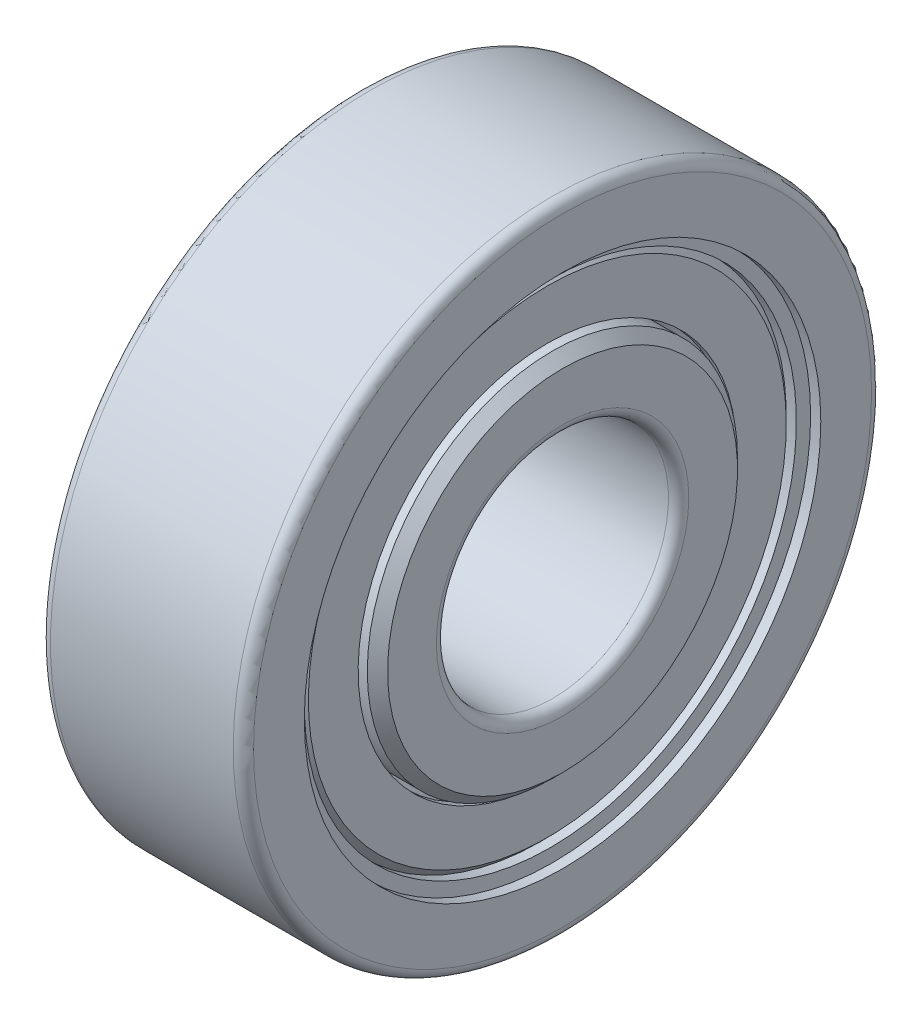
ISO-10303-21;
HEADER;
FILE_DESCRIPTION(('STEP AP214'),'2;1');
FILE_NAME('part.step','',(''),(''),'','','');
FILE_SCHEMA(('AUTOMOTIVE_DESIGN { 1 0 10303 214 1 1 1 1 }'));
ENDSEC;
DATA;
#1=APPLICATION_CONTEXT('core data for automotive mechanical design processes');
#2=APPLICATION_PROTOCOL_DEFINITION('international standard','automotive_design',2000,#1);
#3=PRODUCT_CONTEXT('',#1,'mechanical');
#4=PRODUCT('Part','Part','',(#3));
#5=PRODUCT_RELATED_PRODUCT_CATEGORY('part','',(#4));
#6=PRODUCT_DEFINITION_FORMATION('','',#4);
#7=PRODUCT_DEFINITION_CONTEXT('part definition',#1,'design');
#8=PRODUCT_DEFINITION('design','',#6,#7);
#9=PRODUCT_DEFINITION_SHAPE('','',#8);
#10=(LENGTH_UNIT() NAMED_UNIT(*) SI_UNIT(.MILLI.,.METRE.));
#11=(NAMED_UNIT(*) PLANE_ANGLE_UNIT() SI_UNIT($,.RADIAN.));
#12=(NAMED_UNIT(*) SI_UNIT($,.STERADIAN.) SOLID_ANGLE_UNIT());
#13=UNCERTAINTY_MEASURE_WITH_UNIT(LENGTH_MEASURE(1.E-05),#10,'distance_accuracy_value','');
#14=(GEOMETRIC_REPRESENTATION_CONTEXT(3) GLOBAL_UNCERTAINTY_ASSIGNED_CONTEXT((#13)) GLOBAL_UNIT_ASSIGNED_CONTEXT((#10,
#11,#12)) REPRESENTATION_CONTEXT('',''));
#15=CARTESIAN_POINT('',(0.,0.,0.));
#16=DIRECTION('',(0.,0.,1.));
#17=DIRECTION('',(1.,0.,0.));
#18=AXIS2_PLACEMENT_3D('',#15,#16,#17);
#19=CARTESIAN_POINT('',(3.5,4.,0.));
#20=DIRECTION('',(1.,0.,0.));
#21=DIRECTION('',(0.,1.,0.));
#22=AXIS2_PLACEMENT_3D('',#19,#20,#21);
#23=PLANE('',#22);
#24=CARTESIAN_POINT('',(3.5,0.,0.));
#25=DIRECTION('',(1.,0.,0.));
#26=DIRECTION('',(0.,1.,0.));
#27=AXIS2_PLACEMENT_3D('',#24,#25,#26);
#28=CIRCLE('',#27,6.03);
#29=CARTESIAN_POINT('',(3.5,6.03,0.));
#30=VERTEX_POINT('',#29);
#31=EDGE_CURVE('E69',#30,#30,#28,.T.);
#32=ORIENTED_EDGE('',*,*,#31,.T.);
#33=EDGE_LOOP('',(#32));
#34=FACE_BOUND('',#33,.T.);
#35=CARTESIAN_POINT('',(3.5,0.,0.));
#36=DIRECTION('',(1.,0.,0.));
#37=DIRECTION('',(0.,1.,0.));
#38=AXIS2_PLACEMENT_3D('',#35,#36,#37);
#39=CIRCLE('',#38,4.35);
#40=CARTESIAN_POINT('',(3.5,4.35,0.));
#41=VERTEX_POINT('',#40);
#42=EDGE_CURVE('E95',#41,#41,#39,.F.);
#43=ORIENTED_EDGE('',*,*,#42,.T.);
#44=EDGE_LOOP('',(#43));
#45=FACE_BOUND('',#44,.T.);
#46=ADVANCED_FACE('F47',(#34,#45),#23,.T.);
#47=CARTESIAN_POINT('',(0.,0.,0.));
#48=DIRECTION('',(1.,0.,0.));
#49=DIRECTION('',(0.,1.,0.));
#50=AXIS2_PLACEMENT_3D('',#47,#48,#49);
#51=CYLINDRICAL_SURFACE('',#50,6.38);
#52=CARTESIAN_POINT('',(3.15000000000001,0.,0.));
#53=DIRECTION('',(1.,0.,0.));
#54=DIRECTION('',(0.,1.,0.));
#55=AXIS2_PLACEMENT_3D('',#52,#53,#54);
#56=CIRCLE('',#55,6.38);
#57=CARTESIAN_POINT('',(3.15000000000001,6.38,0.));
#58=VERTEX_POINT('',#57);
#59=EDGE_CURVE('E62',#58,#58,#56,.F.);
#60=ORIENTED_EDGE('',*,*,#59,.T.);
#61=EDGE_LOOP('',(#60));
#62=FACE_BOUND('',#61,.T.);
#63=CARTESIAN_POINT('',(0.999799979996003,0.,0.));
#64=DIRECTION('',(1.,0.,0.));
#65=DIRECTION('',(0.,1.,0.));
#66=AXIS2_PLACEMENT_3D('',#63,#64,#65);
#67=CIRCLE('',#66,6.38);
#68=CARTESIAN_POINT('',(0.999799979996003,6.38,0.));
#69=VERTEX_POINT('',#68);
#70=EDGE_CURVE('E107',#69,#69,#67,.T.);
#71=ORIENTED_EDGE('',*,*,#70,.T.);
#72=EDGE_LOOP('',(#71));
#73=FACE_BOUND('',#72,.T.);
#74=ADVANCED_FACE('F222',(#62,#73),#51,.T.);
#75=CARTESIAN_POINT('',(0.,0.,0.));
#76=DIRECTION('',(1.,0.,0.));
#77=DIRECTION('',(0.,1.,0.));
#78=AXIS2_PLACEMENT_3D('',#75,#76,#77);
#79=TOROIDAL_SURFACE('',#78,7.36,1.4);
#80=CARTESIAN_POINT('',(0.840000000000004,0.,0.));
#81=DIRECTION('',(1.,0.,0.));
#82=DIRECTION('',(0.,1.,0.));
#83=AXIS2_PLACEMENT_3D('',#80,#81,#82);
#84=CIRCLE('',#83,8.48);
#85=CARTESIAN_POINT('',(0.840000000000003,8.48,0.));
#86=VERTEX_POINT('',#85);
#87=EDGE_CURVE('E111',#86,#86,#84,.T.);
#88=ORIENTED_EDGE('',*,*,#87,.T.);
#89=EDGE_LOOP('',(#88));
#90=FACE_BOUND('',#89,.T.);
#91=ORIENTED_EDGE('',*,*,#70,.F.);
#92=EDGE_LOOP('',(#91));
#93=FACE_BOUND('',#92,.T.);
#94=ADVANCED_FACE('F228',(#90,#93),#79,.T.);
#95=CARTESIAN_POINT('',(0.,0.,0.));
#96=DIRECTION('',(1.,0.,0.));
#97=DIRECTION('',(0.,1.,0.));
#98=AXIS2_PLACEMENT_3D('',#95,#96,#97);
#99=CYLINDRICAL_SURFACE('',#98,8.48);
#100=CARTESIAN_POINT('',(2.45,0.,0.));
#101=DIRECTION('',(1.,0.,0.));
#102=DIRECTION('',(0.,1.,0.));
#103=AXIS2_PLACEMENT_3D('',#100,#101,#102);
#104=CIRCLE('',#103,8.48);
#105=CARTESIAN_POINT('',(2.45,8.48,0.));
#106=VERTEX_POINT('',#105);
#107=EDGE_CURVE('E115',#106,#106,#104,.T.);
#108=ORIENTED_EDGE('',*,*,#107,.T.);
#109=EDGE_LOOP('',(#108));
#110=FACE_BOUND('',#109,.T.);
#111=ORIENTED_EDGE('',*,*,#87,.F.);
#112=EDGE_LOOP('',(#111));
#113=FACE_BOUND('',#112,.T.);
#114=ADVANCED_FACE('F263',(#110,#113),#99,.F.);
#115=CARTESIAN_POINT('',(2.45,0.,0.));
#116=DIRECTION('',(-1.,0.,0.));
#117=DIRECTION('',(0.,-1.,0.));
#118=AXIS2_PLACEMENT_3D('',#115,#116,#117);
#119=CONICAL_SURFACE('',#118,8.48,0.785398163397444);
#120=CARTESIAN_POINT('',(2.73000000000001,0.,0.));
#121=DIRECTION('',(1.,0.,0.));
#122=DIRECTION('',(0.,1.,0.));
#123=AXIS2_PLACEMENT_3D('',#120,#121,#122);
#124=CIRCLE('',#123,8.2);
#125=CARTESIAN_POINT('',(2.73000000000001,8.2,0.));
#126=VERTEX_POINT('',#125);
#127=EDGE_CURVE('E119',#126,#126,#124,.T.);
#128=ORIENTED_EDGE('',*,*,#127,.T.);
#129=EDGE_LOOP('',(#128));
#130=FACE_BOUND('',#129,.T.);
#131=ORIENTED_EDGE('',*,*,#107,.F.);
#132=EDGE_LOOP('',(#131));
#133=FACE_BOUND('',#132,.T.);
#134=ADVANCED_FACE('F268',(#130,#133),#119,.F.);
#135=CARTESIAN_POINT('',(2.73000000000001,8.2,0.));
#136=DIRECTION('',(-1.,0.,0.));
#137=DIRECTION('',(0.,-1.,0.));
#138=AXIS2_PLACEMENT_3D('',#135,#136,#137);
#139=PLANE('',#138);
#140=CARTESIAN_POINT('',(2.73000000000001,0.,0.));
#141=DIRECTION('',(1.,0.,0.));
#142=DIRECTION('',(0.,1.,0.));
#143=AXIS2_PLACEMENT_3D('',#140,#141,#142);
#144=CIRCLE('',#143,6.52);
#145=CARTESIAN_POINT('',(2.73000000000001,6.52,0.));
#146=VERTEX_POINT('',#145);
#147=EDGE_CURVE('E123',#146,#146,#144,.T.);
#148=ORIENTED_EDGE('',*,*,#147,.T.);
#149=EDGE_LOOP('',(#148));
#150=FACE_BOUND('',#149,.T.);
#151=ORIENTED_EDGE('',*,*,#127,.F.);
#152=EDGE_LOOP('',(#151));
#153=FACE_BOUND('',#152,.T.);
#154=ADVANCED_FACE('F274',(#150,#153),#139,.T.);
#155=CARTESIAN_POINT('',(0.,0.,0.));
#156=DIRECTION('',(1.,0.,0.));
#157=DIRECTION('',(0.,1.,0.));
#158=AXIS2_PLACEMENT_3D('',#155,#156,#157);
#159=CYLINDRICAL_SURFACE('',#158,6.52);
#160=CARTESIAN_POINT('',(2.975,0.,0.));
#161=DIRECTION('',(1.,0.,0.));
#162=DIRECTION('',(0.,1.,0.));
#163=AXIS2_PLACEMENT_3D('',#160,#161,#162);
#164=CIRCLE('',#163,6.52);
#165=CARTESIAN_POINT('',(2.975,6.52,0.));
#166=VERTEX_POINT('',#165);
#167=EDGE_CURVE('E127',#166,#166,#164,.T.);
#168=ORIENTED_EDGE('',*,*,#167,.T.);
#169=EDGE_LOOP('',(#168));
#170=FACE_BOUND('',#169,.T.);
#171=ORIENTED_EDGE('',*,*,#147,.F.);
#172=EDGE_LOOP('',(#171));
#173=FACE_BOUND('',#172,.T.);
#174=ADVANCED_FACE('F278',(#170,#173),#159,.F.);
#175=CARTESIAN_POINT('',(2.975,6.52,0.));
#176=DIRECTION('',(1.,0.,0.));
#177=DIRECTION('',(0.,1.,0.));
#178=AXIS2_PLACEMENT_3D('',#175,#176,#177);
#179=PLANE('',#178);
#180=CARTESIAN_POINT('',(2.975,0.,0.));
#181=DIRECTION('',(1.,0.,0.));
#182=DIRECTION('',(0.,1.,0.));
#183=AXIS2_PLACEMENT_3D('',#180,#181,#182);
#184=CIRCLE('',#183,8.23500000000001);
#185=CARTESIAN_POINT('',(2.975,8.23500000000001,0.));
#186=VERTEX_POINT('',#185);
#187=EDGE_CURVE('E131',#186,#186,#184,.T.);
#188=ORIENTED_EDGE('',*,*,#187,.T.);
#189=EDGE_LOOP('',(#188));
#190=FACE_BOUND('',#189,.T.);
#191=ORIENTED_EDGE('',*,*,#167,.F.);
#192=EDGE_LOOP('',(#191));
#193=FACE_BOUND('',#192,.T.);
#194=ADVANCED_FACE('F282',(#190,#193),#179,.T.);
#195=CARTESIAN_POINT('',(2.975,0.,0.));
#196=DIRECTION('',(-1.,0.,0.));
#197=DIRECTION('',(0.,-1.,0.));
#198=AXIS2_PLACEMENT_3D('',#195,#196,#197);
#199=CONICAL_SURFACE('',#198,8.23500000000001,0.785398163397438);
#200=CARTESIAN_POINT('',(2.73000000000001,0.,0.));
#201=DIRECTION('',(1.,0.,0.));
#202=DIRECTION('',(0.,1.,0.));
#203=AXIS2_PLACEMENT_3D('',#200,#201,#202);
#204=CIRCLE('',#203,8.48);
#205=CARTESIAN_POINT('',(2.73000000000001,8.48,0.));
#206=VERTEX_POINT('',#205);
#207=EDGE_CURVE('E135',#206,#206,#204,.T.);
#208=ORIENTED_EDGE('',*,*,#207,.T.);
#209=EDGE_LOOP('',(#208));
#210=FACE_BOUND('',#209,.T.);
#211=ORIENTED_EDGE('',*,*,#187,.F.);
#212=EDGE_LOOP('',(#211));
#213=FACE_BOUND('',#212,.T.);
#214=ADVANCED_FACE('F286',(#210,#213),#199,.T.);
#215=CARTESIAN_POINT('',(0.,0.,0.));
#216=DIRECTION('',(1.,0.,0.));
#217=DIRECTION('',(0.,1.,0.));
#218=AXIS2_PLACEMENT_3D('',#215,#216,#217);
#219=CYLINDRICAL_SURFACE('',#218,8.48);
#220=CARTESIAN_POINT('',(3.08,0.,0.));
#221=DIRECTION('',(1.,0.,0.));
#222=DIRECTION('',(0.,1.,0.));
#223=AXIS2_PLACEMENT_3D('',#220,#221,#222);
#224=CIRCLE('',#223,8.48);
#225=CARTESIAN_POINT('',(3.08,8.48,0.));
#226=VERTEX_POINT('',#225);
#227=EDGE_CURVE('E139',#226,#226,#224,.T.);
#228=ORIENTED_EDGE('',*,*,#227,.T.);
#229=EDGE_LOOP('',(#228));
#230=FACE_BOUND('',#229,.T.);
#231=ORIENTED_EDGE('',*,*,#207,.F.);
#232=EDGE_LOOP('',(#231));
#233=FACE_BOUND('',#232,.T.);
#234=ADVANCED_FACE('F290',(#230,#233),#219,.F.);
#235=CARTESIAN_POINT('',(3.08,8.48,0.));
#236=DIRECTION('',(1.,0.,0.));
#237=DIRECTION('',(0.,1.,0.));
#238=AXIS2_PLACEMENT_3D('',#235,#236,#237);
#239=PLANE('',#238);
#240=CARTESIAN_POINT('',(3.08,0.,0.));
#241=DIRECTION('',(1.,0.,0.));
#242=DIRECTION('',(0.,1.,0.));
#243=AXIS2_PLACEMENT_3D('',#240,#241,#242);
#244=CIRCLE('',#243,9.02124355652982);
#245=CARTESIAN_POINT('',(3.08,9.02124355652982,0.));
#246=VERTEX_POINT('',#245);
#247=EDGE_CURVE('E143',#246,#246,#244,.T.);
#248=ORIENTED_EDGE('',*,*,#247,.T.);
#249=EDGE_LOOP('',(#248));
#250=FACE_BOUND('',#249,.T.);
#251=ORIENTED_EDGE('',*,*,#227,.F.);
#252=EDGE_LOOP('',(#251));
#253=FACE_BOUND('',#252,.T.);
#254=ADVANCED_FACE('F294',(#250,#253),#239,.T.);
#255=CARTESIAN_POINT('',(3.08,0.,0.));
#256=DIRECTION('',(-1.,0.,0.));
#257=DIRECTION('',(0.,-1.,0.));
#258=AXIS2_PLACEMENT_3D('',#255,#256,#257);
#259=CONICAL_SURFACE('',#258,9.02124355652982,1.0471975511966);
#260=CARTESIAN_POINT('',(3.15,0.,0.));
#261=DIRECTION('',(1.,0.,0.));
#262=DIRECTION('',(0.,1.,0.));
#263=AXIS2_PLACEMENT_3D('',#260,#261,#262);
#264=CIRCLE('',#263,8.9);
#265=CARTESIAN_POINT('',(3.15,8.9,0.));
#266=VERTEX_POINT('',#265);
#267=EDGE_CURVE('E147',#266,#266,#264,.T.);
#268=ORIENTED_EDGE('',*,*,#267,.T.);
#269=EDGE_LOOP('',(#268));
#270=FACE_BOUND('',#269,.T.);
#271=ORIENTED_EDGE('',*,*,#247,.F.);
#272=EDGE_LOOP('',(#271));
#273=FACE_BOUND('',#272,.T.);
#274=ADVANCED_FACE('F298',(#270,#273),#259,.F.);
#275=CARTESIAN_POINT('',(0.,0.,0.));
#276=DIRECTION('',(1.,0.,0.));
#277=DIRECTION('',(0.,1.,0.));
#278=AXIS2_PLACEMENT_3D('',#275,#276,#277);
#279=CYLINDRICAL_SURFACE('',#278,8.9);
#280=CARTESIAN_POINT('',(3.5,0.,0.));
#281=DIRECTION('',(1.,0.,0.));
#282=DIRECTION('',(0.,1.,0.));
#283=AXIS2_PLACEMENT_3D('',#280,#281,#282);
#284=CIRCLE('',#283,8.9);
#285=CARTESIAN_POINT('',(3.5,8.9,0.));
#286=VERTEX_POINT('',#285);
#287=EDGE_CURVE('E151',#286,#286,#284,.T.);
#288=ORIENTED_EDGE('',*,*,#287,.T.);
#289=EDGE_LOOP('',(#288));
#290=FACE_BOUND('',#289,.T.);
#291=ORIENTED_EDGE('',*,*,#267,.F.);
#292=EDGE_LOOP('',(#291));
#293=FACE_BOUND('',#292,.T.);
#294=ADVANCED_FACE('F302',(#290,#293),#279,.F.);
#295=CARTESIAN_POINT('',(3.5,8.9,0.));
#296=DIRECTION('',(1.,0.,0.));
#297=DIRECTION('',(0.,1.,0.));
#298=AXIS2_PLACEMENT_3D('',#295,#296,#297);
#299=PLANE('',#298);
#300=CARTESIAN_POINT('',(3.5,0.,0.));
#301=DIRECTION('',(1.,0.,0.));
#302=DIRECTION('',(0.,1.,0.));
#303=AXIS2_PLACEMENT_3D('',#300,#301,#302);
#304=CIRCLE('',#303,10.65);
#305=CARTESIAN_POINT('',(3.5,10.65,0.));
#306=VERTEX_POINT('',#305);
#307=EDGE_CURVE('E75',#306,#306,#304,.T.);
#308=ORIENTED_EDGE('',*,*,#307,.T.);
#309=EDGE_LOOP('',(#308));
#310=FACE_BOUND('',#309,.T.);
#311=ORIENTED_EDGE('',*,*,#287,.F.);
#312=EDGE_LOOP('',(#311));
#313=FACE_BOUND('',#312,.T.);
#314=ADVANCED_FACE('F306',(#310,#313),#299,.T.);
#315=CARTESIAN_POINT('',(0.,0.,0.));
#316=DIRECTION('',(1.,0.,0.));
#317=DIRECTION('',(0.,1.,0.));
#318=AXIS2_PLACEMENT_3D('',#315,#316,#317);
#319=CYLINDRICAL_SURFACE('',#318,11.);
#320=CARTESIAN_POINT('',(-3.15,0.,0.));
#321=DIRECTION('',(-1.,0.,0.));
#322=DIRECTION('',(0.,-1.,0.));
#323=AXIS2_PLACEMENT_3D('',#320,#321,#322);
#324=CIRCLE('',#323,11.);
#325=CARTESIAN_POINT('',(-3.15,-11.,0.));
#326=VERTEX_POINT('',#325);
#327=EDGE_CURVE('E83',#326,#326,#324,.F.);
#328=ORIENTED_EDGE('',*,*,#327,.T.);
#329=EDGE_LOOP('',(#328));
#330=FACE_BOUND('',#329,.T.);
#331=CARTESIAN_POINT('',(3.15,0.,0.));
#332=DIRECTION('',(1.,0.,0.));
#333=DIRECTION('',(0.,1.,0.));
#334=AXIS2_PLACEMENT_3D('',#331,#332,#333);
#335=CIRCLE('',#334,11.);
#336=CARTESIAN_POINT('',(3.15,11.,0.));
#337=VERTEX_POINT('',#336);
#338=EDGE_CURVE('E87',#337,#337,#335,.F.);
#339=ORIENTED_EDGE('',*,*,#338,.T.);
#340=EDGE_LOOP('',(#339));
#341=FACE_BOUND('',#340,.T.);
#342=ADVANCED_FACE('F310',(#330,#341),#319,.T.);
#343=CARTESIAN_POINT('',(-3.5,8.9,0.));
#344=DIRECTION('',(-1.,0.,0.));
#345=DIRECTION('',(0.,-1.,0.));
#346=AXIS2_PLACEMENT_3D('',#343,#344,#345);
#347=PLANE('',#346);
#348=CARTESIAN_POINT('',(-3.5,0.,0.));
#349=DIRECTION('',(-1.,0.,0.));
#350=DIRECTION('',(0.,-1.,0.));
#351=AXIS2_PLACEMENT_3D('',#348,#349,#350);
#352=CIRCLE('',#351,10.65);
#353=CARTESIAN_POINT('',(-3.5,-10.65,0.));
#354=VERTEX_POINT('',#353);
#355=EDGE_CURVE('E79',#354,#354,#352,.T.);
#356=ORIENTED_EDGE('',*,*,#355,.T.);
#357=EDGE_LOOP('',(#356));
#358=FACE_BOUND('',#357,.T.);
#359=CARTESIAN_POINT('',(-3.5,0.,0.));
#360=DIRECTION('',(1.,0.,0.));
#361=DIRECTION('',(0.,1.,0.));
#362=AXIS2_PLACEMENT_3D('',#359,#360,#361);
#363=CIRCLE('',#362,8.9);
#364=CARTESIAN_POINT('',(-3.5,8.9,0.));
#365=VERTEX_POINT('',#364);
#366=EDGE_CURVE('E155',#365,#365,#363,.T.);
#367=ORIENTED_EDGE('',*,*,#366,.T.);
#368=EDGE_LOOP('',(#367));
#369=FACE_BOUND('',#368,.T.);
#370=ADVANCED_FACE('F314',(#358,#369),#347,.T.);
#371=CARTESIAN_POINT('',(0.,0.,0.));
#372=DIRECTION('',(1.,0.,0.));
#373=DIRECTION('',(0.,1.,0.));
#374=AXIS2_PLACEMENT_3D('',#371,#372,#373);
#375=CYLINDRICAL_SURFACE('',#374,8.9);
#376=CARTESIAN_POINT('',(-3.15,0.,0.));
#377=DIRECTION('',(1.,0.,0.));
#378=DIRECTION('',(0.,1.,0.));
#379=AXIS2_PLACEMENT_3D('',#376,#377,#378);
#380=CIRCLE('',#379,8.9);
#381=CARTESIAN_POINT('',(-3.15,8.9,0.));
#382=VERTEX_POINT('',#381);
#383=EDGE_CURVE('E159',#382,#382,#380,.T.);
#384=ORIENTED_EDGE('',*,*,#383,.T.);
#385=EDGE_LOOP('',(#384));
#386=FACE_BOUND('',#385,.T.);
#387=ORIENTED_EDGE('',*,*,#366,.F.);
#388=EDGE_LOOP('',(#387));
#389=FACE_BOUND('',#388,.T.);
#390=ADVANCED_FACE('F318',(#386,#389),#375,.F.);
#391=CARTESIAN_POINT('',(-3.15,0.,0.));
#392=DIRECTION('',(1.,0.,0.));
#393=DIRECTION('',(0.,1.,0.));
#394=AXIS2_PLACEMENT_3D('',#391,#392,#393);
#395=CONICAL_SURFACE('',#394,8.9,1.0471975511966);
#396=CARTESIAN_POINT('',(-3.07999999999999,0.,0.));
#397=DIRECTION('',(1.,0.,0.));
#398=DIRECTION('',(0.,1.,0.));
#399=AXIS2_PLACEMENT_3D('',#396,#397,#398);
#400=CIRCLE('',#399,9.02124355652982);
#401=CARTESIAN_POINT('',(-3.08,9.02124355652982,0.));
#402=VERTEX_POINT('',#401);
#403=EDGE_CURVE('E163',#402,#402,#400,.T.);
#404=ORIENTED_EDGE('',*,*,#403,.T.);
#405=EDGE_LOOP('',(#404));
#406=FACE_BOUND('',#405,.T.);
#407=ORIENTED_EDGE('',*,*,#383,.F.);
#408=EDGE_LOOP('',(#407));
#409=FACE_BOUND('',#408,.T.);
#410=ADVANCED_FACE('F322',(#406,#409),#395,.F.);
#411=CARTESIAN_POINT('',(-3.08,8.48,0.));
#412=DIRECTION('',(-1.,0.,0.));
#413=DIRECTION('',(0.,-1.,0.));
#414=AXIS2_PLACEMENT_3D('',#411,#412,#413);
#415=PLANE('',#414);
#416=CARTESIAN_POINT('',(-3.08,0.,0.));
#417=DIRECTION('',(1.,0.,0.));
#418=DIRECTION('',(0.,1.,0.));
#419=AXIS2_PLACEMENT_3D('',#416,#417,#418);
#420=CIRCLE('',#419,8.48);
#421=CARTESIAN_POINT('',(-3.08,8.48,0.));
#422=VERTEX_POINT('',#421);
#423=EDGE_CURVE('E167',#422,#422,#420,.T.);
#424=ORIENTED_EDGE('',*,*,#423,.T.);
#425=EDGE_LOOP('',(#424));
#426=FACE_BOUND('',#425,.T.);
#427=ORIENTED_EDGE('',*,*,#403,.F.);
#428=EDGE_LOOP('',(#427));
#429=FACE_BOUND('',#428,.T.);
#430=ADVANCED_FACE('F326',(#426,#429),#415,.T.);
#431=CARTESIAN_POINT('',(0.,0.,0.));
#432=DIRECTION('',(1.,0.,0.));
#433=DIRECTION('',(0.,1.,0.));
#434=AXIS2_PLACEMENT_3D('',#431,#432,#433);
#435=CYLINDRICAL_SURFACE('',#434,8.48);
#436=CARTESIAN_POINT('',(-2.73,0.,0.));
#437=DIRECTION('',(1.,0.,0.));
#438=DIRECTION('',(0.,1.,0.));
#439=AXIS2_PLACEMENT_3D('',#436,#437,#438);
#440=CIRCLE('',#439,8.48);
#441=CARTESIAN_POINT('',(-2.73,8.48,0.));
#442=VERTEX_POINT('',#441);
#443=EDGE_CURVE('E171',#442,#442,#440,.T.);
#444=ORIENTED_EDGE('',*,*,#443,.T.);
#445=EDGE_LOOP('',(#444));
#446=FACE_BOUND('',#445,.T.);
#447=ORIENTED_EDGE('',*,*,#423,.F.);
#448=EDGE_LOOP('',(#447));
#449=FACE_BOUND('',#448,.T.);
#450=ADVANCED_FACE('F330',(#446,#449),#435,.F.);
#451=CARTESIAN_POINT('',(-2.73,0.,0.));
#452=DIRECTION('',(1.,0.,0.));
#453=DIRECTION('',(0.,1.,0.));
#454=AXIS2_PLACEMENT_3D('',#451,#452,#453);
#455=CONICAL_SURFACE('',#454,8.48,0.785398163397438);
#456=CARTESIAN_POINT('',(-2.975,0.,0.));
#457=DIRECTION('',(1.,0.,0.));
#458=DIRECTION('',(0.,1.,0.));
#459=AXIS2_PLACEMENT_3D('',#456,#457,#458);
#460=CIRCLE('',#459,8.23500000000001);
#461=CARTESIAN_POINT('',(-2.975,8.23500000000001,0.));
#462=VERTEX_POINT('',#461);
#463=EDGE_CURVE('E175',#462,#462,#460,.T.);
#464=ORIENTED_EDGE('',*,*,#463,.T.);
#465=EDGE_LOOP('',(#464));
#466=FACE_BOUND('',#465,.T.);
#467=ORIENTED_EDGE('',*,*,#443,.F.);
#468=EDGE_LOOP('',(#467));
#469=FACE_BOUND('',#468,.T.);
#470=ADVANCED_FACE('F334',(#466,#469),#455,.T.);
#471=CARTESIAN_POINT('',(-2.975,6.52,0.));
#472=DIRECTION('',(-1.,0.,0.));
#473=DIRECTION('',(0.,-1.,0.));
#474=AXIS2_PLACEMENT_3D('',#471,#472,#473);
#475=PLANE('',#474);
#476=CARTESIAN_POINT('',(-2.975,0.,0.));
#477=DIRECTION('',(1.,0.,0.));
#478=DIRECTION('',(0.,1.,0.));
#479=AXIS2_PLACEMENT_3D('',#476,#477,#478);
#480=CIRCLE('',#479,6.52);
#481=CARTESIAN_POINT('',(-2.975,6.52,0.));
#482=VERTEX_POINT('',#481);
#483=EDGE_CURVE('E179',#482,#482,#480,.T.);
#484=ORIENTED_EDGE('',*,*,#483,.T.);
#485=EDGE_LOOP('',(#484));
#486=FACE_BOUND('',#485,.T.);
#487=ORIENTED_EDGE('',*,*,#463,.F.);
#488=EDGE_LOOP('',(#487));
#489=FACE_BOUND('',#488,.T.);
#490=ADVANCED_FACE('F338',(#486,#489),#475,.T.);
#491=CARTESIAN_POINT('',(0.,0.,0.));
#492=DIRECTION('',(1.,0.,0.));
#493=DIRECTION('',(0.,1.,0.));
#494=AXIS2_PLACEMENT_3D('',#491,#492,#493);
#495=CYLINDRICAL_SURFACE('',#494,6.52);
#496=CARTESIAN_POINT('',(-2.73,0.,0.));
#497=DIRECTION('',(1.,0.,0.));
#498=DIRECTION('',(0.,1.,0.));
#499=AXIS2_PLACEMENT_3D('',#496,#497,#498);
#500=CIRCLE('',#499,6.52);
#501=CARTESIAN_POINT('',(-2.73,6.52,0.));
#502=VERTEX_POINT('',#501);
#503=EDGE_CURVE('E183',#502,#502,#500,.T.);
#504=ORIENTED_EDGE('',*,*,#503,.T.);
#505=EDGE_LOOP('',(#504));
#506=FACE_BOUND('',#505,.T.);
#507=ORIENTED_EDGE('',*,*,#483,.F.);
#508=EDGE_LOOP('',(#507));
#509=FACE_BOUND('',#508,.T.);
#510=ADVANCED_FACE('F342',(#506,#509),#495,.F.);
#511=CARTESIAN_POINT('',(-2.73,8.2,0.));
#512=DIRECTION('',(1.,0.,0.));
#513=DIRECTION('',(0.,1.,0.));
#514=AXIS2_PLACEMENT_3D('',#511,#512,#513);
#515=PLANE('',#514);
#516=CARTESIAN_POINT('',(-2.73,0.,0.));
#517=DIRECTION('',(1.,0.,0.));
#518=DIRECTION('',(0.,1.,0.));
#519=AXIS2_PLACEMENT_3D('',#516,#517,#518);
#520=CIRCLE('',#519,8.2);
#521=CARTESIAN_POINT('',(-2.73,8.2,0.));
#522=VERTEX_POINT('',#521);
#523=EDGE_CURVE('E187',#522,#522,#520,.T.);
#524=ORIENTED_EDGE('',*,*,#523,.T.);
#525=EDGE_LOOP('',(#524));
#526=FACE_BOUND('',#525,.T.);
#527=ORIENTED_EDGE('',*,*,#503,.F.);
#528=EDGE_LOOP('',(#527));
#529=FACE_BOUND('',#528,.T.);
#530=ADVANCED_FACE('F346',(#526,#529),#515,.T.);
#531=CARTESIAN_POINT('',(-2.73,0.,0.));
#532=DIRECTION('',(1.,0.,0.));
#533=DIRECTION('',(0.,1.,0.));
#534=AXIS2_PLACEMENT_3D('',#531,#532,#533);
#535=CONICAL_SURFACE('',#534,8.2,0.785398163397444);
#536=CARTESIAN_POINT('',(-2.45,0.,0.));
#537=DIRECTION('',(1.,0.,0.));
#538=DIRECTION('',(0.,1.,0.));
#539=AXIS2_PLACEMENT_3D('',#536,#537,#538);
#540=CIRCLE('',#539,8.48);
#541=CARTESIAN_POINT('',(-2.45,8.48,0.));
#542=VERTEX_POINT('',#541);
#543=EDGE_CURVE('E191',#542,#542,#540,.T.);
#544=ORIENTED_EDGE('',*,*,#543,.T.);
#545=EDGE_LOOP('',(#544));
#546=FACE_BOUND('',#545,.T.);
#547=ORIENTED_EDGE('',*,*,#523,.F.);
#548=EDGE_LOOP('',(#547));
#549=FACE_BOUND('',#548,.T.);
#550=ADVANCED_FACE('F350',(#546,#549),#535,.F.);
#551=CARTESIAN_POINT('',(0.,0.,0.));
#552=DIRECTION('',(1.,0.,0.));
#553=DIRECTION('',(0.,1.,0.));
#554=AXIS2_PLACEMENT_3D('',#551,#552,#553);
#555=CYLINDRICAL_SURFACE('',#554,8.48);
#556=CARTESIAN_POINT('',(-0.839999999999997,0.,0.));
#557=DIRECTION('',(1.,0.,0.));
#558=DIRECTION('',(0.,1.,0.));
#559=AXIS2_PLACEMENT_3D('',#556,#557,#558);
#560=CIRCLE('',#559,8.48);
#561=CARTESIAN_POINT('',(-0.839999999999999,8.48,0.));
#562=VERTEX_POINT('',#561);
#563=EDGE_CURVE('E195',#562,#562,#560,.T.);
#564=ORIENTED_EDGE('',*,*,#563,.T.);
#565=EDGE_LOOP('',(#564));
#566=FACE_BOUND('',#565,.T.);
#567=ORIENTED_EDGE('',*,*,#543,.F.);
#568=EDGE_LOOP('',(#567));
#569=FACE_BOUND('',#568,.T.);
#570=ADVANCED_FACE('F219',(#566,#569),#555,.F.);
#571=CARTESIAN_POINT('',(0.,0.,0.));
#572=DIRECTION('',(1.,0.,0.));
#573=DIRECTION('',(0.,1.,0.));
#574=AXIS2_PLACEMENT_3D('',#571,#572,#573);
#575=TOROIDAL_SURFACE('',#574,7.36,1.4);
#576=CARTESIAN_POINT('',(-0.999799979995997,0.,0.));
#577=DIRECTION('',(1.,0.,0.));
#578=DIRECTION('',(0.,1.,0.));
#579=AXIS2_PLACEMENT_3D('',#576,#577,#578);
#580=CIRCLE('',#579,6.38);
#581=CARTESIAN_POINT('',(-0.999799979995998,6.38,0.));
#582=VERTEX_POINT('',#581);
#583=EDGE_CURVE('E199',#582,#582,#580,.T.);
#584=ORIENTED_EDGE('',*,*,#583,.T.);
#585=EDGE_LOOP('',(#584));
#586=FACE_BOUND('',#585,.T.);
#587=ORIENTED_EDGE('',*,*,#563,.F.);
#588=EDGE_LOOP('',(#587));
#589=FACE_BOUND('',#588,.T.);
#590=ADVANCED_FACE('F206',(#586,#589),#575,.T.);
#591=CARTESIAN_POINT('',(0.,0.,0.));
#592=DIRECTION('',(1.,0.,0.));
#593=DIRECTION('',(0.,1.,0.));
#594=AXIS2_PLACEMENT_3D('',#591,#592,#593);
#595=CYLINDRICAL_SURFACE('',#594,6.38);
#596=CARTESIAN_POINT('',(-3.15,0.,0.));
#597=DIRECTION('',(-1.,0.,0.));
#598=DIRECTION('',(0.,-1.,0.));
#599=AXIS2_PLACEMENT_3D('',#596,#597,#598);
#600=CIRCLE('',#599,6.38);
#601=CARTESIAN_POINT('',(-3.15,-6.38,0.));
#602=VERTEX_POINT('',#601);
#603=EDGE_CURVE('E55',#602,#602,#600,.F.);
#604=ORIENTED_EDGE('',*,*,#603,.T.);
#605=EDGE_LOOP('',(#604));
#606=FACE_BOUND('',#605,.T.);
#607=ORIENTED_EDGE('',*,*,#583,.F.);
#608=EDGE_LOOP('',(#607));
#609=FACE_BOUND('',#608,.T.);
#610=ADVANCED_FACE('F209',(#606,#609),#595,.T.);
#611=CARTESIAN_POINT('',(-3.5,4.,0.));
#612=DIRECTION('',(-1.,0.,0.));
#613=DIRECTION('',(0.,-1.,0.));
#614=AXIS2_PLACEMENT_3D('',#611,#612,#613);
#615=PLANE('',#614);
#616=CARTESIAN_POINT('',(-3.5,0.,0.));
#617=DIRECTION('',(-1.,0.,0.));
#618=DIRECTION('',(0.,-1.,0.));
#619=AXIS2_PLACEMENT_3D('',#616,#617,#618);
#620=CIRCLE('',#619,6.03000000000001);
#621=CARTESIAN_POINT('',(-3.5,-6.03000000000001,0.));
#622=VERTEX_POINT('',#621);
#623=EDGE_CURVE('E10',#622,#622,#620,.T.);
#624=ORIENTED_EDGE('',*,*,#623,.T.);
#625=EDGE_LOOP('',(#624));
#626=FACE_BOUND('',#625,.T.);
#627=CARTESIAN_POINT('',(-3.5,0.,0.));
#628=DIRECTION('',(-1.,0.,0.));
#629=DIRECTION('',(0.,-1.,0.));
#630=AXIS2_PLACEMENT_3D('',#627,#628,#629);
#631=CIRCLE('',#630,4.35);
#632=CARTESIAN_POINT('',(-3.5,-4.35,0.));
#633=VERTEX_POINT('',#632);
#634=EDGE_CURVE('E91',#633,#633,#631,.F.);
#635=ORIENTED_EDGE('',*,*,#634,.T.);
#636=EDGE_LOOP('',(#635));
#637=FACE_BOUND('',#636,.T.);
#638=ADVANCED_FACE('F211',(#626,#637),#615,.T.);
#639=CARTESIAN_POINT('',(0.,0.,0.));
#640=DIRECTION('',(1.,0.,0.));
#641=DIRECTION('',(0.,1.,0.));
#642=AXIS2_PLACEMENT_3D('',#639,#640,#641);
#643=CYLINDRICAL_SURFACE('',#642,4.);
#644=CARTESIAN_POINT('',(3.15,0.,0.));
#645=DIRECTION('',(1.,0.,0.));
#646=DIRECTION('',(0.,1.,0.));
#647=AXIS2_PLACEMENT_3D('',#644,#645,#646);
#648=CIRCLE('',#647,4.);
#649=CARTESIAN_POINT('',(3.15,4.,0.));
#650=VERTEX_POINT('',#649);
#651=EDGE_CURVE('E99',#650,#650,#648,.T.);
#652=ORIENTED_EDGE('',*,*,#651,.T.);
#653=EDGE_LOOP('',(#652));
#654=FACE_BOUND('',#653,.T.);
#655=CARTESIAN_POINT('',(-3.15,0.,0.));
#656=DIRECTION('',(-1.,0.,0.));
#657=DIRECTION('',(0.,-1.,0.));
#658=AXIS2_PLACEMENT_3D('',#655,#656,#657);
#659=CIRCLE('',#658,4.);
#660=CARTESIAN_POINT('',(-3.15,-4.,0.));
#661=VERTEX_POINT('',#660);
#662=EDGE_CURVE('E103',#661,#661,#659,.T.);
#663=ORIENTED_EDGE('',*,*,#662,.T.);
#664=EDGE_LOOP('',(#663));
#665=FACE_BOUND('',#664,.T.);
#666=ADVANCED_FACE('F217',(#654,#665),#643,.F.);
#667=CARTESIAN_POINT('',(3.15,0.,0.));
#668=DIRECTION('',(1.,0.,0.));
#669=DIRECTION('',(0.,1.,0.));
#670=AXIS2_PLACEMENT_3D('',#667,#668,#669);
#671=TOROIDAL_SURFACE('',#670,4.35,0.35);
#672=ORIENTED_EDGE('',*,*,#42,.F.);
#673=EDGE_LOOP('',(#672));
#674=FACE_BOUND('',#673,.T.);
#675=ORIENTED_EDGE('',*,*,#651,.F.);
#676=EDGE_LOOP('',(#675));
#677=FACE_BOUND('',#676,.T.);
#678=ADVANCED_FACE('F234',(#674,#677),#671,.T.);
#679=CARTESIAN_POINT('',(-3.15,0.,0.));
#680=DIRECTION('',(-1.,0.,0.));
#681=DIRECTION('',(0.,-1.,0.));
#682=AXIS2_PLACEMENT_3D('',#679,#680,#681);
#683=TOROIDAL_SURFACE('',#682,4.35,0.35);
#684=ORIENTED_EDGE('',*,*,#662,.F.);
#685=EDGE_LOOP('',(#684));
#686=FACE_BOUND('',#685,.T.);
#687=ORIENTED_EDGE('',*,*,#634,.F.);
#688=EDGE_LOOP('',(#687));
#689=FACE_BOUND('',#688,.T.);
#690=ADVANCED_FACE('F237',(#686,#689),#683,.T.);
#691=CARTESIAN_POINT('',(-3.15,0.,0.));
#692=DIRECTION('',(-1.,0.,0.));
#693=DIRECTION('',(0.,-1.,0.));
#694=AXIS2_PLACEMENT_3D('',#691,#692,#693);
#695=TOROIDAL_SURFACE('',#694,10.65,0.35);
#696=ORIENTED_EDGE('',*,*,#355,.F.);
#697=EDGE_LOOP('',(#696));
#698=FACE_BOUND('',#697,.T.);
#699=ORIENTED_EDGE('',*,*,#327,.F.);
#700=EDGE_LOOP('',(#699));
#701=FACE_BOUND('',#700,.T.);
#702=ADVANCED_FACE('F241',(#698,#701),#695,.T.);
#703=CARTESIAN_POINT('',(3.15,0.,0.));
#704=DIRECTION('',(1.,0.,0.));
#705=DIRECTION('',(0.,1.,0.));
#706=AXIS2_PLACEMENT_3D('',#703,#704,#705);
#707=TOROIDAL_SURFACE('',#706,10.65,0.35);
#708=ORIENTED_EDGE('',*,*,#338,.F.);
#709=EDGE_LOOP('',(#708));
#710=FACE_BOUND('',#709,.T.);
#711=ORIENTED_EDGE('',*,*,#307,.F.);
#712=EDGE_LOOP('',(#711));
#713=FACE_BOUND('',#712,.T.);
#714=ADVANCED_FACE('F245',(#710,#713),#707,.T.);
#715=CARTESIAN_POINT('',(3.5,0.,0.));
#716=DIRECTION('',(-1.,0.,0.));
#717=DIRECTION('',(0.,-1.,0.));
#718=AXIS2_PLACEMENT_3D('',#715,#716,#717);
#719=CONICAL_SURFACE('',#718,6.03,0.785398163397447);
#720=ORIENTED_EDGE('',*,*,#59,.F.);
#721=EDGE_LOOP('',(#720));
#722=FACE_BOUND('',#721,.T.);
#723=ORIENTED_EDGE('',*,*,#31,.F.);
#724=EDGE_LOOP('',(#723));
#725=FACE_BOUND('',#724,.T.);
#726=ADVANCED_FACE('F248',(#722,#725),#719,.T.);
#727=CARTESIAN_POINT('',(-3.15,0.,0.));
#728=DIRECTION('',(1.,0.,0.));
#729=DIRECTION('',(0.,1.,0.));
#730=AXIS2_PLACEMENT_3D('',#727,#728,#729);
#731=CONICAL_SURFACE('',#730,6.38,0.785398163397447);
#732=ORIENTED_EDGE('',*,*,#623,.F.);
#733=EDGE_LOOP('',(#732));
#734=FACE_BOUND('',#733,.T.);
#735=ORIENTED_EDGE('',*,*,#603,.F.);
#736=EDGE_LOOP('',(#735));
#737=FACE_BOUND('',#736,.T.);
#738=ADVANCED_FACE('F49',(#734,#737),#731,.T.);
#739=CLOSED_SHELL('',(#46,#74,#94,#114,#134,#154,#174,#194,#214,#234,#254,#274,#294,#314,#342,
#370,#390,#410,#430,#450,#470,#490,#510,#530,#550,#570,#590,#610,#638,#666,#678,#690,#702,#714,
#726,#738));
#740=MANIFOLD_SOLID_BREP('B2',#739);
#741=ADVANCED_BREP_SHAPE_REPRESENTATION('',(#18,#740),#14);
#742=SHAPE_DEFINITION_REPRESENTATION(#9,#741);
ENDSEC;
END-ISO-10303-21;
